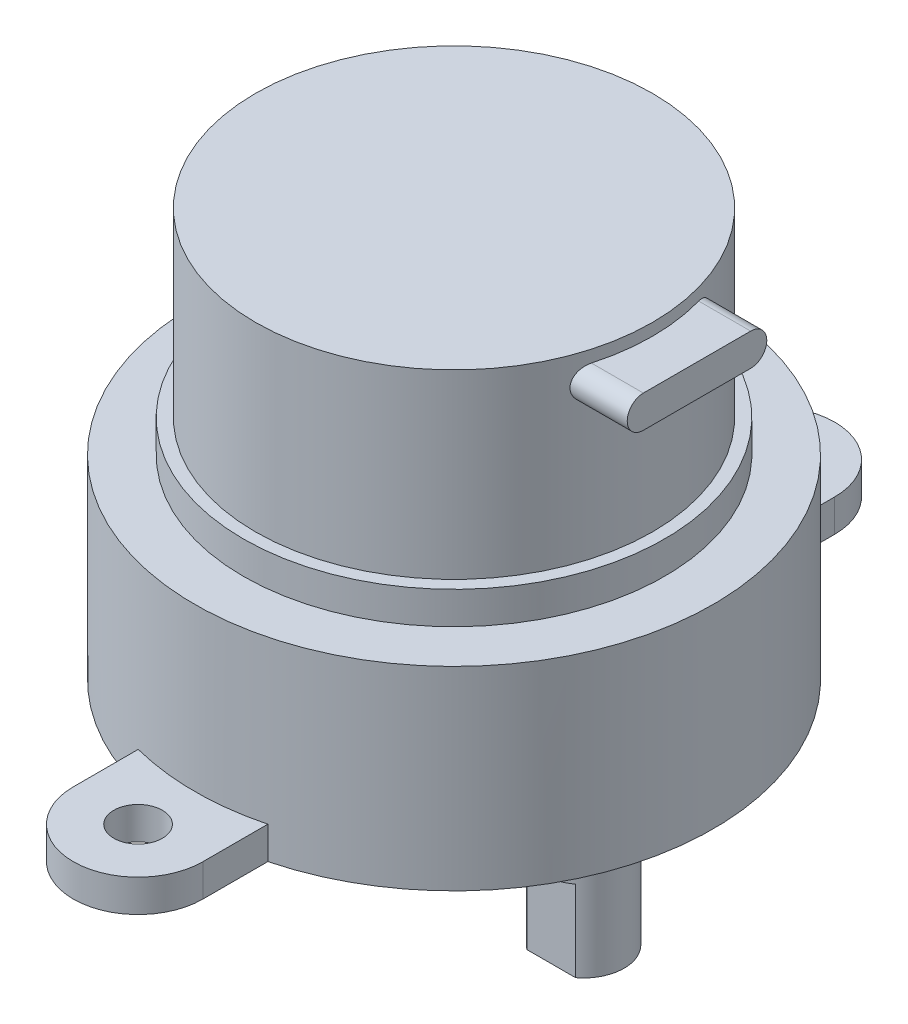
ISO-10303-21;
HEADER;
FILE_DESCRIPTION(('STEP AP214'),'2;1');
FILE_NAME('part.step','',(''),(''),'','','');
FILE_SCHEMA(('AUTOMOTIVE_DESIGN { 1 0 10303 214 1 1 1 1 }'));
ENDSEC;
DATA;
#1=APPLICATION_CONTEXT('core data for automotive mechanical design processes');
#2=APPLICATION_PROTOCOL_DEFINITION('international standard','automotive_design',2000,#1);
#3=PRODUCT_CONTEXT('',#1,'mechanical');
#4=PRODUCT('Part','Part','',(#3));
#5=PRODUCT_RELATED_PRODUCT_CATEGORY('part','',(#4));
#6=PRODUCT_DEFINITION_FORMATION('','',#4);
#7=PRODUCT_DEFINITION_CONTEXT('part definition',#1,'design');
#8=PRODUCT_DEFINITION('design','',#6,#7);
#9=PRODUCT_DEFINITION_SHAPE('','',#8);
#10=(LENGTH_UNIT() NAMED_UNIT(*) SI_UNIT(.MILLI.,.METRE.));
#11=(NAMED_UNIT(*) PLANE_ANGLE_UNIT() SI_UNIT($,.RADIAN.));
#12=(NAMED_UNIT(*) SI_UNIT($,.STERADIAN.) SOLID_ANGLE_UNIT());
#13=UNCERTAINTY_MEASURE_WITH_UNIT(LENGTH_MEASURE(1.E-05),#10,'distance_accuracy_value','');
#14=(GEOMETRIC_REPRESENTATION_CONTEXT(3) GLOBAL_UNCERTAINTY_ASSIGNED_CONTEXT((#13)) GLOBAL_UNIT_ASSIGNED_CONTEXT((#10,
#11,#12)) REPRESENTATION_CONTEXT('',''));
#15=CARTESIAN_POINT('',(0.,0.,0.));
#16=DIRECTION('',(0.,0.,1.));
#17=DIRECTION('',(1.,0.,0.));
#18=AXIS2_PLACEMENT_3D('',#15,#16,#17);
#19=CARTESIAN_POINT('',(0.,0.,0.));
#20=DIRECTION('',(0.,-1.,0.));
#21=DIRECTION('',(0.,0.,-1.));
#22=AXIS2_PLACEMENT_3D('',#19,#20,#21);
#23=CYLINDRICAL_SURFACE('',#22,12.25);
#24=CARTESIAN_POINT('',(0.,25.2,0.));
#25=DIRECTION('',(0.,-1.,0.));
#26=DIRECTION('',(0.,0.,-1.));
#27=AXIS2_PLACEMENT_3D('',#24,#25,#26);
#28=CIRCLE('',#27,12.25);
#29=CARTESIAN_POINT('',(0.,25.2,-12.25));
#30=VERTEX_POINT('',#29);
#31=EDGE_CURVE('E278',#30,#30,#28,.T.);
#32=ORIENTED_EDGE('',*,*,#31,.T.);
#33=EDGE_LOOP('',(#32));
#34=FACE_BOUND('',#33,.T.);
#35=CARTESIAN_POINT('',(0.,14.,0.));
#36=DIRECTION('',(0.,-1.,0.));
#37=DIRECTION('',(0.,0.,-1.));
#38=AXIS2_PLACEMENT_3D('',#35,#36,#37);
#39=CIRCLE('',#38,12.25);
#40=CARTESIAN_POINT('',(0.,14.,-12.25));
#41=VERTEX_POINT('',#40);
#42=EDGE_CURVE('E287',#41,#41,#39,.T.);
#43=ORIENTED_EDGE('',*,*,#42,.F.);
#44=EDGE_LOOP('',(#43));
#45=FACE_BOUND('',#44,.T.);
#46=CARTESIAN_POINT('',(11.4675809570313,23.4612473633165,4.30779375016186));
#47=CARTESIAN_POINT('',(11.4675823385033,23.4077593335019,4.30779099344668));
#48=CARTESIAN_POINT('',(11.4692095829825,23.3542324061449,4.30346594018228));
#49=CARTESIAN_POINT('',(11.4756264183926,23.2487126442959,4.28632456457978));
#50=CARTESIAN_POINT('',(11.4804197990567,23.1967217263525,4.27349806630176));
#51=CARTESIAN_POINT('',(11.4928785863639,23.0958726618714,4.23987736918563));
#52=CARTESIAN_POINT('',(11.5005382010916,23.0470084287369,4.21909923662842));
#53=CARTESIAN_POINT('',(11.518320468869,22.9535502882085,4.17030750836902));
#54=CARTESIAN_POINT('',(11.5284429165426,22.9089560251726,4.14229451597171));
#55=CARTESIAN_POINT('',(11.5510118962276,22.8237440599832,4.07894422169009));
#56=CARTESIAN_POINT('',(11.5635202930667,22.783290687833,4.04340828197144));
#57=CARTESIAN_POINT('',(11.5900882844105,22.7088463008351,3.96661105890876));
#58=CARTESIAN_POINT('',(11.6041483029992,22.6748570596894,3.925348209507));
#59=CARTESIAN_POINT('',(11.6341173315314,22.6122614029789,3.83564508294493));
#60=CARTESIAN_POINT('',(11.6500862627698,22.5840805837996,3.78692756659087));
#61=CARTESIAN_POINT('',(11.6825398072531,22.5363386466494,3.68559280317175));
#62=CARTESIAN_POINT('',(11.6990245400917,22.516779543808,3.63297464777481));
#63=CARTESIAN_POINT('',(11.7325675982206,22.4861915054121,3.52317613039095));
#64=CARTESIAN_POINT('',(11.7496244167997,22.4755074494151,3.46589883774411));
#65=CARTESIAN_POINT('',(11.7831408326881,22.4642703803288,3.35018212660029));
#66=CARTESIAN_POINT('',(11.7996004079001,22.4637177417107,3.29174266522786));
#67=CARTESIAN_POINT('',(11.8314587324005,22.4728883276969,3.17533116369798));
#68=CARTESIAN_POINT('',(11.84685675928,22.482618477868,3.11735946509733));
#69=CARTESIAN_POINT('',(11.8761869827589,22.5122529371446,3.00368583889532));
#70=CARTESIAN_POINT('',(11.8901193763927,22.5321558765436,2.9479836068135));
#71=CARTESIAN_POINT('',(11.9158790092058,22.5810592774422,2.84204598768388));
#72=CARTESIAN_POINT('',(11.9277517038988,22.6098087217877,2.79170585742785));
#73=CARTESIAN_POINT('',(11.949632335806,22.6758383814183,2.69651165120903));
#74=CARTESIAN_POINT('',(11.9596406051303,22.7131170747471,2.65165659867932));
#75=CARTESIAN_POINT('',(11.9773967935066,22.7938797488304,2.5702436297962));
#76=CARTESIAN_POINT('',(11.9852056846173,22.8371328356567,2.53346986273346));
#77=CARTESIAN_POINT('',(11.9989219203498,22.9294581614255,2.46769230545546));
#78=CARTESIAN_POINT('',(12.0048295134508,22.9785296388188,2.43868750000334));
#79=CARTESIAN_POINT('',(12.0146228931243,23.0798989965581,2.38996720561662));
#80=CARTESIAN_POINT('',(12.0185511643041,23.1320994878135,2.37005746040349));
#81=CARTESIAN_POINT('',(12.0245910267929,23.2391896067734,2.33922205814041));
#82=CARTESIAN_POINT('',(12.0267027499351,23.2940790390264,2.32829574913396));
#83=CARTESIAN_POINT('',(12.0291054400941,23.4043170657962,2.31585027769195));
#84=CARTESIAN_POINT('',(12.0294168824626,23.4596532990215,2.31422532904822));
#85=CARTESIAN_POINT('',(12.0282756116245,23.5698130004914,2.32014969518336));
#86=CARTESIAN_POINT('',(12.0268229526254,23.6246364844395,2.32769872806355));
#87=CARTESIAN_POINT('',(12.0221529317679,23.7320583190176,2.35169855398662));
#88=CARTESIAN_POINT('',(12.0189404963002,23.7846624418819,2.36812449492607));
#89=CARTESIAN_POINT('',(12.010744672023,23.8863316202914,2.4093466683474));
#90=CARTESIAN_POINT('',(12.0057612816738,23.9353966727596,2.43414290810688));
#91=CARTESIAN_POINT('',(11.9939963491293,24.0288544243439,2.49146706923415));
#92=CARTESIAN_POINT('',(11.9872066244494,24.0732245443576,2.52403010202333));
#93=CARTESIAN_POINT('',(11.9718658137999,24.1558442883359,2.59581832362416));
#94=CARTESIAN_POINT('',(11.9633146508401,24.1940936446399,2.63504380362966));
#95=CARTESIAN_POINT('',(11.9443922091913,24.2639704856366,2.71953861939047));
#96=CARTESIAN_POINT('',(11.9339979907413,24.2955019572501,2.76488216825394));
#97=CARTESIAN_POINT('',(11.9115991849343,24.3505329164594,2.85983963253004));
#98=CARTESIAN_POINT('',(11.8995944320143,24.3740315773993,2.90945398679372));
#99=CARTESIAN_POINT('',(11.87386396104,24.4129688241672,3.01276497878558));
#100=CARTESIAN_POINT('',(11.8601038428095,24.428200338636,3.06653103090423));
#101=CARTESIAN_POINT('',(11.8313833390476,24.4494706012072,3.17553874700752));
#102=CARTESIAN_POINT('',(11.8164227553828,24.4555078285208,3.2307806535698));
#103=CARTESIAN_POINT('',(11.7851788909282,24.4584089547756,3.34298560264983));
#104=CARTESIAN_POINT('',(11.7688689516277,24.4549819026307,3.39994877404448));
#105=CARTESIAN_POINT('',(11.7358160357641,24.4385179670514,3.51234343943391));
#106=CARTESIAN_POINT('',(11.7190729839281,24.425479402206,3.56777466367368));
#107=CARTESIAN_POINT('',(11.6852796808295,24.3897257005263,3.67696675730414));
#108=CARTESIAN_POINT('',(11.668231920419,24.36678189258,3.73065371093514));
#109=CARTESIAN_POINT('',(11.6348851678132,24.3117595834273,3.83338846061191));
#110=CARTESIAN_POINT('',(11.618586204954,24.2796807246852,3.88243607497911));
#111=CARTESIAN_POINT('',(11.5874930528142,24.2072754968389,3.97427350910224));
#112=CARTESIAN_POINT('',(11.5726937709582,24.1669785425613,4.01708473889054));
#113=CARTESIAN_POINT('',(11.5452641666523,24.0790458869729,4.09525282774274));
#114=CARTESIAN_POINT('',(11.5326338724324,24.03141009016,4.13060958978566));
#115=CARTESIAN_POINT('',(11.5107335226863,23.9322345374763,4.19124240582583));
#116=CARTESIAN_POINT('',(11.5013453292659,23.8809403371594,4.21687727777042));
#117=CARTESIAN_POINT('',(11.485800954343,23.7743336095482,4.25903599311431));
#118=CARTESIAN_POINT('',(11.4796391428014,23.719028275049,4.27557571011682));
#119=CARTESIAN_POINT('',(11.4727370937353,23.6295788049058,4.29404844374202));
#120=CARTESIAN_POINT('',(11.4708084072725,23.5961551420819,4.29919387044317));
#121=CARTESIAN_POINT('',(11.4682299239353,23.5289086207151,4.30606733686667));
#122=CARTESIAN_POINT('',(11.4675800830634,23.4950857759459,4.30779549415704));
#123=CARTESIAN_POINT('',(11.4675809570313,23.4612473633165,4.30779375016186));
#124=B_SPLINE_CURVE_WITH_KNOTS('',3,(#46,#47,#48,#49,#50,#51,#52,#53,#54,#55,#56,#57,#58,#59,
#60,#61,#62,#63,#64,#65,#66,#67,#68,#69,#70,#71,#72,#73,#74,#75,#76,#77,#78,#79,#80,#81,#82,#83,
#84,#85,#86,#87,#88,#89,#90,#91,#92,#93,#94,#95,#96,#97,#98,#99,#100,#101,#102,#103,#104,#105,
#106,#107,#108,#109,#110,#111,#112,#113,#114,#115,#116,#117,#118,#119,#120,#121,#122,#123),
.UNSPECIFIED.,.T.,.F.,(4,2,2,2,2,2,2,2,2,2,2,2,2,2,2,2,2,2,2,2,2,2,2,2,2,2,2,2,2,2,2,2,2,2,2,2,
2,2,4),(0.,0.160335631717507,0.320863527145081,0.481068773864909,0.641260665603355,
0.806375694334494,0.97153596404701,1.14625874597288,1.32102234373742,1.50229573412719,
1.6835758246187,1.8649780870221,2.04635593110691,2.22299956749898,2.39961170820781,
2.57069285143226,2.74175162709696,2.9089630727303,3.07616238222651,3.24145626369603,
3.40674506613324,3.57157349953342,3.736402076245,3.90199041035302,4.06758598365019,
4.2354094559419,4.40325019374128,4.57512083232464,4.74701989622891,4.92426180413779,
5.10153472560851,5.28313948744046,5.46475135805334,5.6457242523715,5.8266995019331,
6.0001297597559,6.17325636448256,6.27469382540995,6.37612779641367),.UNSPECIFIED.);
#125=CARTESIAN_POINT('',(11.7938401604838,24.4572690396545,3.31177207382386));
#126=VERTEX_POINT('',#125);
#127=CARTESIAN_POINT('',(11.7938401604838,22.4652256869785,3.31177207382386));
#128=VERTEX_POINT('',#127);
#129=EDGE_CURVE('E11',#126,#128,#124,.T.);
#130=ORIENTED_EDGE('',*,*,#129,.F.);
#131=CARTESIAN_POINT('',(0.,24.4572690396545,0.));
#132=DIRECTION('',(0.,-1.,0.));
#133=DIRECTION('',(0.,0.,-1.));
#134=AXIS2_PLACEMENT_3D('',#131,#132,#133);
#135=CIRCLE('',#134,12.25);
#136=CARTESIAN_POINT('',(11.7938401604838,24.4572690396545,-3.31177207382386));
#137=VERTEX_POINT('',#136);
#138=EDGE_CURVE('E318',#137,#126,#135,.T.);
#139=ORIENTED_EDGE('',*,*,#138,.F.);
#140=CARTESIAN_POINT('',(12.0291229978143,23.4612473633165,-2.31575039748586));
#141=CARTESIAN_POINT('',(12.0291228553257,23.4061389226955,-2.31575289313123));
#142=CARTESIAN_POINT('',(12.0282421603531,23.3509919431753,-2.32034049925517));
#143=CARTESIAN_POINT('',(12.0247123860103,23.2422276986138,-2.33856254909503));
#144=CARTESIAN_POINT('',(12.0220612662266,23.1886122731202,-2.35220743120757));
#145=CARTESIAN_POINT('',(12.014981252209,23.0845097052514,-2.38810763952254));
#146=CARTESIAN_POINT('',(12.0105536134619,23.0340203826486,-2.41035688451991));
#147=CARTESIAN_POINT('',(11.9999171649735,22.9375537194032,-2.46276254765663));
#148=CARTESIAN_POINT('',(11.9937087670059,22.8915753389679,-2.49291713766545));
#149=CARTESIAN_POINT('',(11.979486149344,22.8051149912536,-2.56039123389823));
#150=CARTESIAN_POINT('',(11.9714619965741,22.764665298295,-2.59774997765174));
#151=CARTESIAN_POINT('',(11.9536813163949,22.6906198009533,-2.67837714902325));
#152=CARTESIAN_POINT('',(11.9439246245273,22.6570246478765,-2.7216461375708));
#153=CARTESIAN_POINT('',(11.9226050196896,22.5969952275102,-2.81358314820831));
#154=CARTESIAN_POINT('',(11.9110142443529,22.5706922707957,-2.86233038597002));
#155=CARTESIAN_POINT('',(11.8863279108954,22.5265983734431,-2.96317442875599));
#156=CARTESIAN_POINT('',(11.8732321641352,22.508808501316,-3.01527165332002));
#157=CARTESIAN_POINT('',(11.8454086442429,22.4817007760372,-3.12281276152129));
#158=CARTESIAN_POINT('',(11.8306461091522,22.4726271358747,-3.17830916370482));
#159=CARTESIAN_POINT('',(11.8001379643754,22.4639000023519,-3.28976969102008));
#160=CARTESIAN_POINT('',(11.7843921853909,22.4642481357524,-3.3457338952548));
#161=CARTESIAN_POINT('',(11.7518369919498,22.4744029827549,-3.45837656968306));
#162=CARTESIAN_POINT('',(11.7350097444568,22.4845017309319,-3.51502364734338));
#163=CARTESIAN_POINT('',(11.7012793111345,22.5142644324736,-3.62572948547661));
#164=CARTESIAN_POINT('',(11.6843761135055,22.5339299269048,-3.6797878273995));
#165=CARTESIAN_POINT('',(11.6508013500551,22.5827551992244,-3.78476130023629));
#166=CARTESIAN_POINT('',(11.6341388613286,22.6120734602319,-3.83560580751444));
#167=CARTESIAN_POINT('',(11.6020427934053,22.6794033770414,-3.93162420764904));
#168=CARTESIAN_POINT('',(11.5866091966694,22.7174149087412,-3.97679818144184));
#169=CARTESIAN_POINT('',(11.5579491173835,22.8005041968163,-4.05933402552607));
#170=CARTESIAN_POINT('',(11.5446900688513,22.8454532897723,-4.09681380204468));
#171=CARTESIAN_POINT('',(11.5207842854396,22.9416991413625,-4.16356711000504));
#172=CARTESIAN_POINT('',(11.5101366360511,22.9929936683392,-4.19284351477101));
#173=CARTESIAN_POINT('',(11.4925767489849,23.0976137924924,-4.24073095976884));
#174=CARTESIAN_POINT('',(11.4854980848176,23.1506923260232,-4.25982026684391));
#175=CARTESIAN_POINT('',(11.4747090452421,23.2596274889466,-4.28879883558905));
#176=CARTESIAN_POINT('',(11.4709973032477,23.3154829814918,-4.29869182995334));
#177=CARTESIAN_POINT('',(11.4672904833259,23.4250471614881,-4.30856985059715));
#178=CARTESIAN_POINT('',(11.4671006457497,23.4787030484158,-4.30907407730417));
#179=CARTESIAN_POINT('',(11.4699513629619,23.5853099372084,-4.30148021162517));
#180=CARTESIAN_POINT('',(11.4729915093543,23.6382610273301,-4.29338320677032));
#181=CARTESIAN_POINT('',(11.482042441929,23.7410546409375,-4.26911738851811));
#182=CARTESIAN_POINT('',(11.4880023774942,23.7909344805128,-4.25308669983221));
#183=CARTESIAN_POINT('',(11.5025438942778,23.8872470778856,-4.2135999088054));
#184=CARTESIAN_POINT('',(11.5111257963249,23.9336794129752,-4.19014289775285));
#185=CARTESIAN_POINT('',(11.5308024301263,24.0234370516613,-4.13569305169541));
#186=CARTESIAN_POINT('',(11.541969482943,24.0666132122947,-4.10448094364599));
#187=CARTESIAN_POINT('',(11.5661279313887,24.1471742367255,-4.03590196440492));
#188=CARTESIAN_POINT('',(11.579119799787,24.1845575944398,-3.99853349780141));
#189=CARTESIAN_POINT('',(11.6071789919347,24.2547298441668,-3.91636092482331));
#190=CARTESIAN_POINT('',(11.6223225375842,24.2871334219824,-3.87125369283732));
#191=CARTESIAN_POINT('',(11.6534519627556,24.3439299365395,-3.77651208608961));
#192=CARTESIAN_POINT('',(11.6694380564882,24.3683208246088,-3.72687655767842));
#193=CARTESIAN_POINT('',(11.7024370069865,24.4094872927087,-3.62196428713271));
#194=CARTESIAN_POINT('',(11.7194631869705,24.4258591627592,-3.56653288403953));
#195=CARTESIAN_POINT('',(11.7532411802952,24.4488037553132,-3.45359173643233));
#196=CARTESIAN_POINT('',(11.7699929643278,24.4553754377231,-3.39608177198397));
#197=CARTESIAN_POINT('',(11.802902751075,24.4584727431792,-3.27988917122721));
#198=CARTESIAN_POINT('',(11.8190515792993,24.4548806103797,-3.2212006758717));
#199=CARTESIAN_POINT('',(11.8500971415596,24.4373478592483,-3.10504614431646));
#200=CARTESIAN_POINT('',(11.8649939933023,24.423408214971,-3.04757999357603));
#201=CARTESIAN_POINT('',(11.8928924844919,24.3858059570778,-2.93680229195475));
#202=CARTESIAN_POINT('',(11.9059264171865,24.3623461395958,-2.88343014143513));
#203=CARTESIAN_POINT('',(11.9301996840858,24.3062584666141,-2.78129337219548));
#204=CARTESIAN_POINT('',(11.9414394057494,24.2736325947308,-2.73252775962696));
#205=CARTESIAN_POINT('',(11.9616347229007,24.2012604972276,-2.64269773086271));
#206=CARTESIAN_POINT('',(11.9706517723668,24.1617747757959,-2.60143718884967));
#207=CARTESIAN_POINT('',(11.9867748134512,24.0760987628605,-2.52610719291297));
#208=CARTESIAN_POINT('',(11.993880621718,24.0299078287584,-2.4920384289869));
#209=CARTESIAN_POINT('',(12.005992981891,23.9334226533427,-2.4330064881146));
#210=CARTESIAN_POINT('',(12.0110481639672,23.8832620414687,-2.40783446116526));
#211=CARTESIAN_POINT('',(12.019309108042,23.779336591955,-2.36625491774498));
#212=CARTESIAN_POINT('',(12.0225172220688,23.7255764357884,-2.34983625685307));
#213=CARTESIAN_POINT('',(12.0262484315747,23.6364280820677,-2.33064399334522));
#214=CARTESIAN_POINT('',(12.027326342603,23.6016407431264,-2.32506679527641));
#215=CARTESIAN_POINT('',(12.028763668412,23.5316566332881,-2.31761921464727));
#216=CARTESIAN_POINT('',(12.0291230888598,23.4964598656228,-2.31574880284959));
#217=CARTESIAN_POINT('',(12.0291229978143,23.4612473633165,-2.31575039748586));
#218=B_SPLINE_CURVE_WITH_KNOTS('',3,(#140,#141,#142,#143,#144,#145,#146,#147,#148,#149,#150,
#151,#152,#153,#154,#155,#156,#157,#158,#159,#160,#161,#162,#163,#164,#165,#166,#167,#168,#169,
#170,#171,#172,#173,#174,#175,#176,#177,#178,#179,#180,#181,#182,#183,#184,#185,#186,#187,#188,
#189,#190,#191,#192,#193,#194,#195,#196,#197,#198,#199,#200,#201,#202,#203,#204,#205,#206,#207,
#208,#209,#210,#211,#212,#213,#214,#215,#216,#217),.UNSPECIFIED.,.T.,.F.,(4,2,2,2,2,2,2,2,2,2,2,
2,2,2,2,2,2,2,2,2,2,2,2,2,2,2,2,2,2,2,2,2,2,2,2,2,2,2,4),(0.,0.16519613219826,0.330582982185192,
0.49585315663109,0.661085145603034,0.827243877341872,0.993418389846258,1.16241519743595,
1.33143321092765,1.50505947822985,1.67871572398328,1.85773972987867,2.0367925835432,
2.21894544273645,2.40109570174005,2.58020281834711,2.7592471220067,2.92891450638551,
3.09851299430883,3.25870298018482,3.41887271420894,3.57634712356885,3.73384080951896,
3.89643039575452,4.0590621833284,4.23100014590652,4.40298203516394,4.58290638324749,
4.76284982533794,4.94488656206978,5.12690616509212,5.30523651165676,5.483528295621,
5.65612938477877,5.82874702620753,5.99699075851276,6.1650197752654,6.27057556676477,
6.37613052568712),.UNSPECIFIED.);
#219=CARTESIAN_POINT('',(11.7938401604839,22.4652256869772,-3.31177207382403));
#220=VERTEX_POINT('',#219);
#221=EDGE_CURVE('E67',#220,#137,#218,.T.);
#222=ORIENTED_EDGE('',*,*,#221,.F.);
#223=CARTESIAN_POINT('',(0.,22.4652256869785,0.));
#224=DIRECTION('',(0.,1.,0.));
#225=DIRECTION('',(0.,0.,1.));
#226=AXIS2_PLACEMENT_3D('',#223,#224,#225);
#227=CIRCLE('',#226,12.25);
#228=EDGE_CURVE('E57',#128,#220,#227,.T.);
#229=ORIENTED_EDGE('',*,*,#228,.F.);
#230=EDGE_LOOP('',(#130,#139,#222,#229));
#231=FACE_BOUND('',#230,.T.);
#232=ADVANCED_FACE('F44',(#34,#45,#231),#23,.T.);
#233=CARTESIAN_POINT('',(0.,0.,0.));
#234=DIRECTION('',(0.,1.,0.));
#235=DIRECTION('',(0.,0.,1.));
#236=AXIS2_PLACEMENT_3D('',#233,#234,#235);
#237=PLANE('',#236);
#238=CARTESIAN_POINT('',(8.,0.,0.));
#239=DIRECTION('',(0.,1.,0.));
#240=DIRECTION('',(-1.,0.,0.));
#241=AXIS2_PLACEMENT_3D('',#238,#239,#240);
#242=CIRCLE('',#241,4.5);
#243=CARTESIAN_POINT('',(3.5,0.,0.));
#244=VERTEX_POINT('',#243);
#245=EDGE_CURVE('E201',#244,#244,#242,.T.);
#246=ORIENTED_EDGE('',*,*,#245,.T.);
#247=EDGE_LOOP('',(#246));
#248=FACE_BOUND('',#247,.T.);
#249=CARTESIAN_POINT('',(0.,0.,0.));
#250=DIRECTION('',(0.,-1.,0.));
#251=DIRECTION('',(0.,0.,-1.));
#252=AXIS2_PLACEMENT_3D('',#249,#250,#251);
#253=CIRCLE('',#252,16.);
#254=CARTESIAN_POINT('',(4.,0.,-15.4919333848297));
#255=VERTEX_POINT('',#254);
#256=CARTESIAN_POINT('',(3.99999999999999,0.,15.4919333848297));
#257=VERTEX_POINT('',#256);
#258=EDGE_CURVE('E300',#255,#257,#253,.T.);
#259=ORIENTED_EDGE('',*,*,#258,.T.);
#260=DIRECTION('',(0.,0.,1.));
#261=VECTOR('',#260,1.);
#262=CARTESIAN_POINT('',(4.,0.,-19.5));
#263=LINE('',#262,#261);
#264=CARTESIAN_POINT('',(3.99999999999999,0.,19.5));
#265=VERTEX_POINT('',#264);
#266=EDGE_CURVE('E267',#257,#265,#263,.T.);
#267=ORIENTED_EDGE('',*,*,#266,.T.);
#268=CARTESIAN_POINT('',(0.,0.,19.5));
#269=DIRECTION('',(0.,-1.,0.));
#270=DIRECTION('',(0.,0.,-1.));
#271=AXIS2_PLACEMENT_3D('',#268,#269,#270);
#272=CIRCLE('',#271,4.);
#273=CARTESIAN_POINT('',(-4.00000000000001,0.,19.5));
#274=VERTEX_POINT('',#273);
#275=EDGE_CURVE('E270',#265,#274,#272,.T.);
#276=ORIENTED_EDGE('',*,*,#275,.T.);
#277=DIRECTION('',(0.,0.,-1.));
#278=VECTOR('',#277,1.);
#279=CARTESIAN_POINT('',(-4.,0.,-19.5));
#280=LINE('',#279,#278);
#281=CARTESIAN_POINT('',(-4.,0.,15.4919333848297));
#282=VERTEX_POINT('',#281);
#283=EDGE_CURVE('E253',#274,#282,#280,.T.);
#284=ORIENTED_EDGE('',*,*,#283,.T.);
#285=CARTESIAN_POINT('',(-4.,0.,-15.4919333848297));
#286=VERTEX_POINT('',#285);
#287=EDGE_CURVE('E299',#282,#286,#253,.T.);
#288=ORIENTED_EDGE('',*,*,#287,.T.);
#289=CARTESIAN_POINT('',(-4.,0.,-19.5));
#290=VERTEX_POINT('',#289);
#291=EDGE_CURVE('E273',#286,#290,#280,.T.);
#292=ORIENTED_EDGE('',*,*,#291,.T.);
#293=CARTESIAN_POINT('',(0.,0.,-19.5));
#294=DIRECTION('',(0.,-1.,0.));
#295=DIRECTION('',(0.,0.,-1.));
#296=AXIS2_PLACEMENT_3D('',#293,#294,#295);
#297=CIRCLE('',#296,4.);
#298=CARTESIAN_POINT('',(4.,0.,-19.5));
#299=VERTEX_POINT('',#298);
#300=EDGE_CURVE('E246',#290,#299,#297,.T.);
#301=ORIENTED_EDGE('',*,*,#300,.T.);
#302=EDGE_CURVE('E268',#299,#255,#263,.T.);
#303=ORIENTED_EDGE('',*,*,#302,.T.);
#304=EDGE_LOOP('',(#259,#267,#276,#284,#288,#292,#301,#303));
#305=FACE_BOUND('',#304,.T.);
#306=CARTESIAN_POINT('',(0.,0.,-19.5));
#307=DIRECTION('',(0.,-1.,0.));
#308=DIRECTION('',(0.,0.,-1.));
#309=AXIS2_PLACEMENT_3D('',#306,#307,#308);
#310=CIRCLE('',#309,1.5);
#311=CARTESIAN_POINT('',(0.,0.,-21.));
#312=VERTEX_POINT('',#311);
#313=EDGE_CURVE('E236',#312,#312,#310,.T.);
#314=ORIENTED_EDGE('',*,*,#313,.F.);
#315=EDGE_LOOP('',(#314));
#316=FACE_BOUND('',#315,.T.);
#317=CARTESIAN_POINT('',(0.,0.,19.5));
#318=DIRECTION('',(0.,-1.,0.));
#319=DIRECTION('',(0.,0.,-1.));
#320=AXIS2_PLACEMENT_3D('',#317,#318,#319);
#321=CIRCLE('',#320,1.5);
#322=CARTESIAN_POINT('',(0.,0.,18.));
#323=VERTEX_POINT('',#322);
#324=EDGE_CURVE('E240',#323,#323,#321,.T.);
#325=ORIENTED_EDGE('',*,*,#324,.F.);
#326=EDGE_LOOP('',(#325));
#327=FACE_BOUND('',#326,.T.);
#328=ADVANCED_FACE('F46',(#248,#305,#316,#327),#237,.F.);
#329=CARTESIAN_POINT('',(0.,0.,0.));
#330=DIRECTION('',(0.,-1.,0.));
#331=DIRECTION('',(0.,0.,-1.));
#332=AXIS2_PLACEMENT_3D('',#329,#330,#331);
#333=CYLINDRICAL_SURFACE('',#332,16.);
#334=ORIENTED_EDGE('',*,*,#287,.F.);
#335=DIRECTION('',(0.,-1.,0.));
#336=VECTOR('',#335,1.);
#337=CARTESIAN_POINT('',(-4.,0.,15.4919333848297));
#338=LINE('',#337,#336);
#339=CARTESIAN_POINT('',(-4.,2.,15.4919333848297));
#340=VERTEX_POINT('',#339);
#341=EDGE_CURVE('E315',#282,#340,#338,.F.);
#342=ORIENTED_EDGE('',*,*,#341,.T.);
#343=CARTESIAN_POINT('',(0.,2.,0.));
#344=DIRECTION('',(0.,-1.,0.));
#345=DIRECTION('',(0.,0.,-1.));
#346=AXIS2_PLACEMENT_3D('',#343,#344,#345);
#347=CIRCLE('',#346,16.);
#348=CARTESIAN_POINT('',(3.99999999999999,2.,15.4919333848297));
#349=VERTEX_POINT('',#348);
#350=EDGE_CURVE('E306',#349,#340,#347,.T.);
#351=ORIENTED_EDGE('',*,*,#350,.F.);
#352=DIRECTION('',(0.,-1.,0.));
#353=VECTOR('',#352,1.);
#354=CARTESIAN_POINT('',(3.99999999999999,0.,15.4919333848297));
#355=LINE('',#354,#353);
#356=EDGE_CURVE('E312',#349,#257,#355,.T.);
#357=ORIENTED_EDGE('',*,*,#356,.T.);
#358=ORIENTED_EDGE('',*,*,#258,.F.);
#359=DIRECTION('',(0.,-1.,0.));
#360=VECTOR('',#359,1.);
#361=CARTESIAN_POINT('',(4.,0.,-15.4919333848297));
#362=LINE('',#361,#360);
#363=CARTESIAN_POINT('',(4.,2.,-15.4919333848297));
#364=VERTEX_POINT('',#363);
#365=EDGE_CURVE('E305',#255,#364,#362,.F.);
#366=ORIENTED_EDGE('',*,*,#365,.T.);
#367=CARTESIAN_POINT('',(-4.,2.,-15.4919333848297));
#368=VERTEX_POINT('',#367);
#369=EDGE_CURVE('E303',#368,#364,#347,.T.);
#370=ORIENTED_EDGE('',*,*,#369,.F.);
#371=DIRECTION('',(0.,-1.,0.));
#372=VECTOR('',#371,1.);
#373=CARTESIAN_POINT('',(-4.,0.,-15.4919333848297));
#374=LINE('',#373,#372);
#375=EDGE_CURVE('E309',#368,#286,#374,.T.);
#376=ORIENTED_EDGE('',*,*,#375,.T.);
#377=EDGE_LOOP('',(#334,#342,#351,#357,#358,#366,#370,#376));
#378=FACE_BOUND('',#377,.T.);
#379=CARTESIAN_POINT('',(0.,12.,0.));
#380=DIRECTION('',(0.,-1.,0.));
#381=DIRECTION('',(0.,0.,-1.));
#382=AXIS2_PLACEMENT_3D('',#379,#380,#381);
#383=CIRCLE('',#382,16.);
#384=CARTESIAN_POINT('',(0.,12.,-16.));
#385=VERTEX_POINT('',#384);
#386=EDGE_CURVE('E296',#385,#385,#383,.T.);
#387=ORIENTED_EDGE('',*,*,#386,.T.);
#388=EDGE_LOOP('',(#387));
#389=FACE_BOUND('',#388,.T.);
#390=ADVANCED_FACE('F433',(#378,#389),#333,.T.);
#391=CARTESIAN_POINT('',(-16.,12.,0.));
#392=DIRECTION('',(0.,-1.,0.));
#393=DIRECTION('',(0.,0.,-1.));
#394=AXIS2_PLACEMENT_3D('',#391,#392,#393);
#395=PLANE('',#394);
#396=ORIENTED_EDGE('',*,*,#386,.F.);
#397=EDGE_LOOP('',(#396));
#398=FACE_BOUND('',#397,.T.);
#399=CARTESIAN_POINT('',(0.,12.,0.));
#400=DIRECTION('',(0.,-1.,0.));
#401=DIRECTION('',(0.,0.,-1.));
#402=AXIS2_PLACEMENT_3D('',#399,#400,#401);
#403=CIRCLE('',#402,13.);
#404=CARTESIAN_POINT('',(0.,12.,-13.));
#405=VERTEX_POINT('',#404);
#406=EDGE_CURVE('E293',#405,#405,#403,.T.);
#407=ORIENTED_EDGE('',*,*,#406,.T.);
#408=EDGE_LOOP('',(#407));
#409=FACE_BOUND('',#408,.T.);
#410=ADVANCED_FACE('F629',(#398,#409),#395,.F.);
#411=CARTESIAN_POINT('',(0.,0.,0.));
#412=DIRECTION('',(0.,-1.,0.));
#413=DIRECTION('',(0.,0.,-1.));
#414=AXIS2_PLACEMENT_3D('',#411,#412,#413);
#415=CYLINDRICAL_SURFACE('',#414,13.);
#416=ORIENTED_EDGE('',*,*,#406,.F.);
#417=EDGE_LOOP('',(#416));
#418=FACE_BOUND('',#417,.T.);
#419=CARTESIAN_POINT('',(0.,14.,0.));
#420=DIRECTION('',(0.,-1.,0.));
#421=DIRECTION('',(0.,0.,-1.));
#422=AXIS2_PLACEMENT_3D('',#419,#420,#421);
#423=CIRCLE('',#422,13.);
#424=CARTESIAN_POINT('',(0.,14.,-13.));
#425=VERTEX_POINT('',#424);
#426=EDGE_CURVE('E290',#425,#425,#423,.T.);
#427=ORIENTED_EDGE('',*,*,#426,.T.);
#428=EDGE_LOOP('',(#427));
#429=FACE_BOUND('',#428,.T.);
#430=ADVANCED_FACE('F425',(#418,#429),#415,.T.);
#431=CARTESIAN_POINT('',(-13.,14.,0.));
#432=DIRECTION('',(0.,-1.,0.));
#433=DIRECTION('',(0.,0.,-1.));
#434=AXIS2_PLACEMENT_3D('',#431,#432,#433);
#435=PLANE('',#434);
#436=ORIENTED_EDGE('',*,*,#426,.F.);
#437=EDGE_LOOP('',(#436));
#438=FACE_BOUND('',#437,.T.);
#439=ORIENTED_EDGE('',*,*,#42,.T.);
#440=EDGE_LOOP('',(#439));
#441=FACE_BOUND('',#440,.T.);
#442=ADVANCED_FACE('F420',(#438,#441),#435,.F.);
#443=CARTESIAN_POINT('',(-12.25,25.2,0.));
#444=DIRECTION('',(0.,-1.,0.));
#445=DIRECTION('',(0.,0.,-1.));
#446=AXIS2_PLACEMENT_3D('',#443,#444,#445);
#447=PLANE('',#446);
#448=ORIENTED_EDGE('',*,*,#31,.F.);
#449=EDGE_LOOP('',(#448));
#450=FACE_BOUND('',#449,.T.);
#451=ADVANCED_FACE('F393',(#450),#447,.F.);
#452=CARTESIAN_POINT('',(0.,2.,-19.5));
#453=DIRECTION('',(0.,-1.,0.));
#454=DIRECTION('',(0.,0.,-1.));
#455=AXIS2_PLACEMENT_3D('',#452,#453,#454);
#456=CYLINDRICAL_SURFACE('',#455,1.5);
#457=CARTESIAN_POINT('',(0.,2.,-19.5));
#458=DIRECTION('',(0.,-1.,0.));
#459=DIRECTION('',(0.,0.,-1.));
#460=AXIS2_PLACEMENT_3D('',#457,#458,#459);
#461=CIRCLE('',#460,1.5);
#462=CARTESIAN_POINT('',(0.,2.,-21.));
#463=VERTEX_POINT('',#462);
#464=EDGE_CURVE('E237',#463,#463,#461,.T.);
#465=ORIENTED_EDGE('',*,*,#464,.F.);
#466=EDGE_LOOP('',(#465));
#467=FACE_BOUND('',#466,.T.);
#468=ORIENTED_EDGE('',*,*,#313,.T.);
#469=EDGE_LOOP('',(#468));
#470=FACE_BOUND('',#469,.T.);
#471=ADVANCED_FACE('F389',(#467,#470),#456,.F.);
#472=CARTESIAN_POINT('',(0.,2.,-19.5));
#473=DIRECTION('',(0.,-1.,0.));
#474=DIRECTION('',(0.,0.,-1.));
#475=AXIS2_PLACEMENT_3D('',#472,#473,#474);
#476=CYLINDRICAL_SURFACE('',#475,4.);
#477=ORIENTED_EDGE('',*,*,#300,.F.);
#478=DIRECTION('',(0.,-1.,0.));
#479=VECTOR('',#478,1.);
#480=CARTESIAN_POINT('',(-4.,2.,-19.5));
#481=LINE('',#480,#479);
#482=CARTESIAN_POINT('',(-4.,2.,-19.5));
#483=VERTEX_POINT('',#482);
#484=EDGE_CURVE('E275',#483,#290,#481,.T.);
#485=ORIENTED_EDGE('',*,*,#484,.F.);
#486=CARTESIAN_POINT('',(0.,2.,-19.5));
#487=DIRECTION('',(0.,-1.,0.));
#488=DIRECTION('',(0.,0.,-1.));
#489=AXIS2_PLACEMENT_3D('',#486,#487,#488);
#490=CIRCLE('',#489,4.);
#491=CARTESIAN_POINT('',(4.,2.,-19.5));
#492=VERTEX_POINT('',#491);
#493=EDGE_CURVE('E249',#483,#492,#490,.T.);
#494=ORIENTED_EDGE('',*,*,#493,.T.);
#495=DIRECTION('',(0.,-1.,0.));
#496=VECTOR('',#495,1.);
#497=CARTESIAN_POINT('',(4.,2.,-19.5));
#498=LINE('',#497,#496);
#499=EDGE_CURVE('E264',#492,#299,#498,.T.);
#500=ORIENTED_EDGE('',*,*,#499,.T.);
#501=EDGE_LOOP('',(#477,#485,#494,#500));
#502=FACE_BOUND('',#501,.T.);
#503=ADVANCED_FACE('F392',(#502),#476,.T.);
#504=CARTESIAN_POINT('',(0.,2.,-19.5));
#505=DIRECTION('',(0.,-1.,0.));
#506=DIRECTION('',(0.,0.,-1.));
#507=AXIS2_PLACEMENT_3D('',#504,#505,#506);
#508=PLANE('',#507);
#509=ORIENTED_EDGE('',*,*,#464,.T.);
#510=EDGE_LOOP('',(#509));
#511=FACE_BOUND('',#510,.T.);
#512=DIRECTION('',(0.,0.,-1.));
#513=VECTOR('',#512,1.);
#514=CARTESIAN_POINT('',(-4.,2.,-19.5));
#515=LINE('',#514,#513);
#516=EDGE_CURVE('E260',#368,#483,#515,.T.);
#517=ORIENTED_EDGE('',*,*,#516,.F.);
#518=ORIENTED_EDGE('',*,*,#369,.T.);
#519=DIRECTION('',(0.,0.,1.));
#520=VECTOR('',#519,1.);
#521=CARTESIAN_POINT('',(4.,2.,-19.5));
#522=LINE('',#521,#520);
#523=EDGE_CURVE('E254',#492,#364,#522,.T.);
#524=ORIENTED_EDGE('',*,*,#523,.F.);
#525=ORIENTED_EDGE('',*,*,#493,.F.);
#526=EDGE_LOOP('',(#517,#518,#524,#525));
#527=FACE_BOUND('',#526,.T.);
#528=ADVANCED_FACE('F399',(#511,#527),#508,.F.);
#529=CARTESIAN_POINT('',(4.,2.,-19.5));
#530=DIRECTION('',(1.,0.,0.));
#531=DIRECTION('',(0.,0.,-1.));
#532=AXIS2_PLACEMENT_3D('',#529,#530,#531);
#533=PLANE('',#532);
#534=ORIENTED_EDGE('',*,*,#365,.F.);
#535=ORIENTED_EDGE('',*,*,#302,.F.);
#536=ORIENTED_EDGE('',*,*,#499,.F.);
#537=ORIENTED_EDGE('',*,*,#523,.T.);
#538=EDGE_LOOP('',(#534,#535,#536,#537));
#539=FACE_BOUND('',#538,.T.);
#540=ADVANCED_FACE('F402',(#539),#533,.T.);
#541=CARTESIAN_POINT('',(-4.,2.,-19.5));
#542=DIRECTION('',(-1.,0.,0.));
#543=DIRECTION('',(0.,0.,1.));
#544=AXIS2_PLACEMENT_3D('',#541,#542,#543);
#545=PLANE('',#544);
#546=ORIENTED_EDGE('',*,*,#375,.F.);
#547=ORIENTED_EDGE('',*,*,#516,.T.);
#548=ORIENTED_EDGE('',*,*,#484,.T.);
#549=ORIENTED_EDGE('',*,*,#291,.F.);
#550=EDGE_LOOP('',(#546,#547,#548,#549));
#551=FACE_BOUND('',#550,.T.);
#552=ADVANCED_FACE('F405',(#551),#545,.T.);
#553=ORIENTED_EDGE('',*,*,#341,.F.);
#554=ORIENTED_EDGE('',*,*,#283,.F.);
#555=DIRECTION('',(0.,-1.,0.));
#556=VECTOR('',#555,1.);
#557=CARTESIAN_POINT('',(-4.00000000000001,2.,19.5));
#558=LINE('',#557,#556);
#559=CARTESIAN_POINT('',(-4.00000000000001,2.,19.5));
#560=VERTEX_POINT('',#559);
#561=EDGE_CURVE('E279',#560,#274,#558,.T.);
#562=ORIENTED_EDGE('',*,*,#561,.F.);
#563=EDGE_CURVE('E261',#560,#340,#515,.T.);
#564=ORIENTED_EDGE('',*,*,#563,.T.);
#565=EDGE_LOOP('',(#553,#554,#562,#564));
#566=FACE_BOUND('',#565,.T.);
#567=ADVANCED_FACE('F408',(#566),#545,.T.);
#568=ORIENTED_EDGE('',*,*,#356,.F.);
#569=CARTESIAN_POINT('',(3.99999999999999,2.,19.5));
#570=VERTEX_POINT('',#569);
#571=EDGE_CURVE('E252',#349,#570,#522,.T.);
#572=ORIENTED_EDGE('',*,*,#571,.T.);
#573=DIRECTION('',(0.,-1.,0.));
#574=VECTOR('',#573,1.);
#575=CARTESIAN_POINT('',(3.99999999999999,2.,19.5));
#576=LINE('',#575,#574);
#577=EDGE_CURVE('E281',#570,#265,#576,.T.);
#578=ORIENTED_EDGE('',*,*,#577,.T.);
#579=ORIENTED_EDGE('',*,*,#266,.F.);
#580=EDGE_LOOP('',(#568,#572,#578,#579));
#581=FACE_BOUND('',#580,.T.);
#582=ADVANCED_FACE('F413',(#581),#533,.T.);
#583=CARTESIAN_POINT('',(0.,2.,19.5));
#584=DIRECTION('',(0.,-1.,0.));
#585=DIRECTION('',(0.,0.,-1.));
#586=AXIS2_PLACEMENT_3D('',#583,#584,#585);
#587=CIRCLE('',#586,1.5);
#588=CARTESIAN_POINT('',(0.,2.,18.));
#589=VERTEX_POINT('',#588);
#590=EDGE_CURVE('E243',#589,#589,#587,.T.);
#591=ORIENTED_EDGE('',*,*,#590,.T.);
#592=EDGE_LOOP('',(#591));
#593=FACE_BOUND('',#592,.T.);
#594=ORIENTED_EDGE('',*,*,#571,.F.);
#595=ORIENTED_EDGE('',*,*,#350,.T.);
#596=ORIENTED_EDGE('',*,*,#563,.F.);
#597=CARTESIAN_POINT('',(0.,2.,19.5));
#598=DIRECTION('',(0.,-1.,0.));
#599=DIRECTION('',(0.,0.,-1.));
#600=AXIS2_PLACEMENT_3D('',#597,#598,#599);
#601=CIRCLE('',#600,4.);
#602=EDGE_CURVE('E257',#570,#560,#601,.T.);
#603=ORIENTED_EDGE('',*,*,#602,.F.);
#604=EDGE_LOOP('',(#594,#595,#596,#603));
#605=FACE_BOUND('',#604,.T.);
#606=ADVANCED_FACE('F404',(#593,#605),#508,.F.);
#607=CARTESIAN_POINT('',(0.,2.,19.5));
#608=DIRECTION('',(0.,-1.,0.));
#609=DIRECTION('',(0.,0.,-1.));
#610=AXIS2_PLACEMENT_3D('',#607,#608,#609);
#611=CYLINDRICAL_SURFACE('',#610,4.);
#612=ORIENTED_EDGE('',*,*,#275,.F.);
#613=ORIENTED_EDGE('',*,*,#577,.F.);
#614=ORIENTED_EDGE('',*,*,#602,.T.);
#615=ORIENTED_EDGE('',*,*,#561,.T.);
#616=EDGE_LOOP('',(#612,#613,#614,#615));
#617=FACE_BOUND('',#616,.T.);
#618=ADVANCED_FACE('F397',(#617),#611,.T.);
#619=CARTESIAN_POINT('',(0.,2.,19.5));
#620=DIRECTION('',(0.,-1.,0.));
#621=DIRECTION('',(0.,0.,-1.));
#622=AXIS2_PLACEMENT_3D('',#619,#620,#621);
#623=CYLINDRICAL_SURFACE('',#622,1.5);
#624=ORIENTED_EDGE('',*,*,#590,.F.);
#625=EDGE_LOOP('',(#624));
#626=FACE_BOUND('',#625,.T.);
#627=ORIENTED_EDGE('',*,*,#324,.T.);
#628=EDGE_LOOP('',(#627));
#629=FACE_BOUND('',#628,.T.);
#630=ADVANCED_FACE('F387',(#626,#629),#623,.F.);
#631=CARTESIAN_POINT('',(8.,-10.2,0.));
#632=DIRECTION('',(0.,-1.,0.));
#633=DIRECTION('',(1.,0.,0.));
#634=AXIS2_PLACEMENT_3D('',#631,#632,#633);
#635=PLANE('',#634);
#636=DIRECTION('',(1.,0.,0.));
#637=VECTOR('',#636,1.);
#638=CARTESIAN_POINT('',(5.32727360302391,-10.2,2.));
#639=LINE('',#638,#637);
#640=CARTESIAN_POINT('',(6.5,-10.2,2.));
#641=VERTEX_POINT('',#640);
#642=CARTESIAN_POINT('',(9.5,-10.2,2.));
#643=VERTEX_POINT('',#642);
#644=EDGE_CURVE('E193',#641,#643,#639,.T.);
#645=ORIENTED_EDGE('',*,*,#644,.F.);
#646=CARTESIAN_POINT('',(8.,-10.2,0.));
#647=DIRECTION('',(0.,1.,0.));
#648=DIRECTION('',(-1.,0.,0.));
#649=AXIS2_PLACEMENT_3D('',#646,#647,#648);
#650=CIRCLE('',#649,2.5);
#651=CARTESIAN_POINT('',(6.5,-10.2,-2.));
#652=VERTEX_POINT('',#651);
#653=EDGE_CURVE('E216',#652,#641,#650,.T.);
#654=ORIENTED_EDGE('',*,*,#653,.F.);
#655=DIRECTION('',(-1.,0.,0.));
#656=VECTOR('',#655,1.);
#657=CARTESIAN_POINT('',(3.62547666157584,-10.2,-2.));
#658=LINE('',#657,#656);
#659=CARTESIAN_POINT('',(9.5,-10.2,-2.));
#660=VERTEX_POINT('',#659);
#661=EDGE_CURVE('E182',#660,#652,#658,.T.);
#662=ORIENTED_EDGE('',*,*,#661,.F.);
#663=EDGE_CURVE('E219',#643,#660,#650,.T.);
#664=ORIENTED_EDGE('',*,*,#663,.F.);
#665=EDGE_LOOP('',(#645,#654,#662,#664));
#666=FACE_BOUND('',#665,.T.);
#667=CARTESIAN_POINT('',(8.,-10.2,0.));
#668=DIRECTION('',(0.,-1.,0.));
#669=DIRECTION('',(0.,0.,-1.));
#670=AXIS2_PLACEMENT_3D('',#667,#668,#669);
#671=CIRCLE('',#670,1.24999999999999);
#672=CARTESIAN_POINT('',(8.,-10.2,-1.24999999999999));
#673=VERTEX_POINT('',#672);
#674=EDGE_CURVE('E192',#673,#673,#671,.T.);
#675=ORIENTED_EDGE('',*,*,#674,.F.);
#676=EDGE_LOOP('',(#675));
#677=FACE_BOUND('',#676,.T.);
#678=ADVANCED_FACE('F383',(#666,#677),#635,.T.);
#679=CARTESIAN_POINT('',(8.,0.,0.));
#680=DIRECTION('',(0.,1.,0.));
#681=DIRECTION('',(-1.,0.,0.));
#682=AXIS2_PLACEMENT_3D('',#679,#680,#681);
#683=CYLINDRICAL_SURFACE('',#682,2.5);
#684=DIRECTION('',(0.,1.,0.));
#685=VECTOR('',#684,1.);
#686=CARTESIAN_POINT('',(6.5,0.,2.));
#687=LINE('',#686,#685);
#688=CARTESIAN_POINT('',(6.5,-5.2,2.));
#689=VERTEX_POINT('',#688);
#690=EDGE_CURVE('E234',#689,#641,#687,.F.);
#691=ORIENTED_EDGE('',*,*,#690,.F.);
#692=CARTESIAN_POINT('',(8.,-5.2,0.));
#693=DIRECTION('',(0.,-1.,0.));
#694=DIRECTION('',(1.,0.,0.));
#695=AXIS2_PLACEMENT_3D('',#692,#693,#694);
#696=CIRCLE('',#695,2.5);
#697=CARTESIAN_POINT('',(9.5,-5.2,2.));
#698=VERTEX_POINT('',#697);
#699=EDGE_CURVE('E228',#689,#698,#696,.F.);
#700=ORIENTED_EDGE('',*,*,#699,.T.);
#701=DIRECTION('',(0.,1.,0.));
#702=VECTOR('',#701,1.);
#703=CARTESIAN_POINT('',(9.5,0.,2.));
#704=LINE('',#703,#702);
#705=EDGE_CURVE('E231',#643,#698,#704,.T.);
#706=ORIENTED_EDGE('',*,*,#705,.F.);
#707=ORIENTED_EDGE('',*,*,#663,.T.);
#708=DIRECTION('',(0.,1.,0.));
#709=VECTOR('',#708,1.);
#710=CARTESIAN_POINT('',(9.5,0.,-2.));
#711=LINE('',#710,#709);
#712=CARTESIAN_POINT('',(9.5,-5.2,-2.));
#713=VERTEX_POINT('',#712);
#714=EDGE_CURVE('E226',#713,#660,#711,.F.);
#715=ORIENTED_EDGE('',*,*,#714,.F.);
#716=CARTESIAN_POINT('',(8.,-5.2,0.));
#717=DIRECTION('',(0.,-1.,0.));
#718=DIRECTION('',(1.,0.,0.));
#719=AXIS2_PLACEMENT_3D('',#716,#717,#718);
#720=CIRCLE('',#719,2.5);
#721=CARTESIAN_POINT('',(6.5,-5.2,-2.));
#722=VERTEX_POINT('',#721);
#723=EDGE_CURVE('E220',#713,#722,#720,.F.);
#724=ORIENTED_EDGE('',*,*,#723,.T.);
#725=DIRECTION('',(0.,1.,0.));
#726=VECTOR('',#725,1.);
#727=CARTESIAN_POINT('',(6.5,0.,-2.));
#728=LINE('',#727,#726);
#729=EDGE_CURVE('E223',#652,#722,#728,.T.);
#730=ORIENTED_EDGE('',*,*,#729,.F.);
#731=ORIENTED_EDGE('',*,*,#653,.T.);
#732=EDGE_LOOP('',(#691,#700,#706,#707,#715,#724,#730,#731));
#733=FACE_BOUND('',#732,.T.);
#734=CARTESIAN_POINT('',(8.,-2.7,0.));
#735=DIRECTION('',(0.,1.,0.));
#736=DIRECTION('',(-1.,0.,0.));
#737=AXIS2_PLACEMENT_3D('',#734,#735,#736);
#738=CIRCLE('',#737,2.5);
#739=CARTESIAN_POINT('',(5.5,-2.7,0.));
#740=VERTEX_POINT('',#739);
#741=EDGE_CURVE('E213',#740,#740,#738,.T.);
#742=ORIENTED_EDGE('',*,*,#741,.F.);
#743=EDGE_LOOP('',(#742));
#744=FACE_BOUND('',#743,.T.);
#745=ADVANCED_FACE('F379',(#733,#744),#683,.T.);
#746=CARTESIAN_POINT('',(4.,-2.7,0.));
#747=DIRECTION('',(0.,-1.,0.));
#748=DIRECTION('',(1.,0.,0.));
#749=AXIS2_PLACEMENT_3D('',#746,#747,#748);
#750=PLANE('',#749);
#751=ORIENTED_EDGE('',*,*,#741,.T.);
#752=EDGE_LOOP('',(#751));
#753=FACE_BOUND('',#752,.T.);
#754=CARTESIAN_POINT('',(8.,-2.7,0.));
#755=DIRECTION('',(0.,1.,0.));
#756=DIRECTION('',(-1.,0.,0.));
#757=AXIS2_PLACEMENT_3D('',#754,#755,#756);
#758=CIRCLE('',#757,4.);
#759=CARTESIAN_POINT('',(4.,-2.7,0.));
#760=VERTEX_POINT('',#759);
#761=EDGE_CURVE('E210',#760,#760,#758,.T.);
#762=ORIENTED_EDGE('',*,*,#761,.F.);
#763=EDGE_LOOP('',(#762));
#764=FACE_BOUND('',#763,.T.);
#765=ADVANCED_FACE('F375',(#753,#764),#750,.T.);
#766=CARTESIAN_POINT('',(8.,0.,0.));
#767=DIRECTION('',(0.,1.,0.));
#768=DIRECTION('',(-1.,0.,0.));
#769=AXIS2_PLACEMENT_3D('',#766,#767,#768);
#770=CYLINDRICAL_SURFACE('',#769,4.);
#771=ORIENTED_EDGE('',*,*,#761,.T.);
#772=EDGE_LOOP('',(#771));
#773=FACE_BOUND('',#772,.T.);
#774=CARTESIAN_POINT('',(8.,-1.25,0.));
#775=DIRECTION('',(0.,1.,0.));
#776=DIRECTION('',(-1.,0.,0.));
#777=AXIS2_PLACEMENT_3D('',#774,#775,#776);
#778=CIRCLE('',#777,4.);
#779=CARTESIAN_POINT('',(4.,-1.25,0.));
#780=VERTEX_POINT('',#779);
#781=EDGE_CURVE('E207',#780,#780,#778,.T.);
#782=ORIENTED_EDGE('',*,*,#781,.F.);
#783=EDGE_LOOP('',(#782));
#784=FACE_BOUND('',#783,.T.);
#785=ADVANCED_FACE('F371',(#773,#784),#770,.T.);
#786=CARTESIAN_POINT('',(3.5,-1.25,0.));
#787=DIRECTION('',(0.,-1.,0.));
#788=DIRECTION('',(1.,0.,0.));
#789=AXIS2_PLACEMENT_3D('',#786,#787,#788);
#790=PLANE('',#789);
#791=ORIENTED_EDGE('',*,*,#781,.T.);
#792=EDGE_LOOP('',(#791));
#793=FACE_BOUND('',#792,.T.);
#794=CARTESIAN_POINT('',(8.,-1.25,0.));
#795=DIRECTION('',(0.,1.,0.));
#796=DIRECTION('',(-1.,0.,0.));
#797=AXIS2_PLACEMENT_3D('',#794,#795,#796);
#798=CIRCLE('',#797,4.5);
#799=CARTESIAN_POINT('',(3.5,-1.25,0.));
#800=VERTEX_POINT('',#799);
#801=EDGE_CURVE('E204',#800,#800,#798,.T.);
#802=ORIENTED_EDGE('',*,*,#801,.F.);
#803=EDGE_LOOP('',(#802));
#804=FACE_BOUND('',#803,.T.);
#805=ADVANCED_FACE('F367',(#793,#804),#790,.T.);
#806=CARTESIAN_POINT('',(8.,0.,0.));
#807=DIRECTION('',(0.,1.,0.));
#808=DIRECTION('',(-1.,0.,0.));
#809=AXIS2_PLACEMENT_3D('',#806,#807,#808);
#810=CYLINDRICAL_SURFACE('',#809,4.5);
#811=ORIENTED_EDGE('',*,*,#801,.T.);
#812=EDGE_LOOP('',(#811));
#813=FACE_BOUND('',#812,.T.);
#814=ORIENTED_EDGE('',*,*,#245,.F.);
#815=EDGE_LOOP('',(#814));
#816=FACE_BOUND('',#815,.T.);
#817=ADVANCED_FACE('F363',(#813,#816),#810,.T.);
#818=CARTESIAN_POINT('',(8.,-2.7,0.));
#819=DIRECTION('',(0.,-1.,0.));
#820=DIRECTION('',(0.,0.,-1.));
#821=AXIS2_PLACEMENT_3D('',#818,#819,#820);
#822=CONICAL_SURFACE('',#821,1.24999999999999,1.02974425867665);
#823=CARTESIAN_POINT('',(8.,-1.94892422621555,0.));
#824=VERTEX_POINT('',#823);
#825=VERTEX_LOOP('',#824);
#826=FACE_BOUND('',#825,.T.);
#827=CARTESIAN_POINT('',(8.,-2.7,0.));
#828=DIRECTION('',(0.,-1.,0.));
#829=DIRECTION('',(0.,0.,-1.));
#830=AXIS2_PLACEMENT_3D('',#827,#828,#829);
#831=CIRCLE('',#830,1.24999999999999);
#832=CARTESIAN_POINT('',(8.,-2.7,-1.24999999999999));
#833=VERTEX_POINT('',#832);
#834=EDGE_CURVE('E198',#833,#833,#831,.T.);
#835=ORIENTED_EDGE('',*,*,#834,.T.);
#836=EDGE_LOOP('',(#835));
#837=FACE_BOUND('',#836,.T.);
#838=ADVANCED_FACE('F359',(#826,#837),#822,.F.);
#839=CARTESIAN_POINT('',(8.,-10.2,0.));
#840=DIRECTION('',(0.,-1.,0.));
#841=DIRECTION('',(0.,0.,-1.));
#842=AXIS2_PLACEMENT_3D('',#839,#840,#841);
#843=CYLINDRICAL_SURFACE('',#842,1.24999999999999);
#844=ORIENTED_EDGE('',*,*,#834,.F.);
#845=EDGE_LOOP('',(#844));
#846=FACE_BOUND('',#845,.T.);
#847=ORIENTED_EDGE('',*,*,#674,.T.);
#848=EDGE_LOOP('',(#847));
#849=FACE_BOUND('',#848,.T.);
#850=ADVANCED_FACE('F355',(#846,#849),#843,.F.);
#851=CARTESIAN_POINT('',(3.62547666157584,-5.2,-2.));
#852=DIRECTION('',(0.,0.,1.));
#853=DIRECTION('',(1.,0.,0.));
#854=AXIS2_PLACEMENT_3D('',#851,#852,#853);
#855=PLANE('',#854);
#856=ORIENTED_EDGE('',*,*,#714,.T.);
#857=ORIENTED_EDGE('',*,*,#661,.T.);
#858=ORIENTED_EDGE('',*,*,#729,.T.);
#859=DIRECTION('',(-1.,0.,0.));
#860=VECTOR('',#859,1.);
#861=CARTESIAN_POINT('',(3.62547666157584,-5.2,-2.));
#862=LINE('',#861,#860);
#863=EDGE_CURVE('E184',#713,#722,#862,.T.);
#864=ORIENTED_EDGE('',*,*,#863,.F.);
#865=EDGE_LOOP('',(#856,#857,#858,#864));
#866=FACE_BOUND('',#865,.T.);
#867=ADVANCED_FACE('F351',(#866),#855,.F.);
#868=CARTESIAN_POINT('',(0.,-5.2,0.));
#869=DIRECTION('',(0.,-1.,0.));
#870=DIRECTION('',(1.,0.,0.));
#871=AXIS2_PLACEMENT_3D('',#868,#869,#870);
#872=PLANE('',#871);
#873=ORIENTED_EDGE('',*,*,#863,.T.);
#874=ORIENTED_EDGE('',*,*,#723,.F.);
#875=EDGE_LOOP('',(#873,#874));
#876=FACE_BOUND('',#875,.T.);
#877=ADVANCED_FACE('F347',(#876),#872,.T.);
#878=CARTESIAN_POINT('',(5.32727360302391,-5.2,2.));
#879=DIRECTION('',(0.,0.,-1.));
#880=DIRECTION('',(-1.,0.,0.));
#881=AXIS2_PLACEMENT_3D('',#878,#879,#880);
#882=PLANE('',#881);
#883=ORIENTED_EDGE('',*,*,#690,.T.);
#884=ORIENTED_EDGE('',*,*,#644,.T.);
#885=ORIENTED_EDGE('',*,*,#705,.T.);
#886=DIRECTION('',(1.,0.,0.));
#887=VECTOR('',#886,1.);
#888=CARTESIAN_POINT('',(5.32727360302391,-5.2,2.));
#889=LINE('',#888,#887);
#890=EDGE_CURVE('E190',#689,#698,#889,.T.);
#891=ORIENTED_EDGE('',*,*,#890,.F.);
#892=EDGE_LOOP('',(#883,#884,#885,#891));
#893=FACE_BOUND('',#892,.T.);
#894=ADVANCED_FACE('F343',(#893),#882,.F.);
#895=CARTESIAN_POINT('',(0.,-5.2,0.));
#896=DIRECTION('',(0.,-1.,0.));
#897=DIRECTION('',(1.,0.,0.));
#898=AXIS2_PLACEMENT_3D('',#895,#896,#897);
#899=PLANE('',#898);
#900=ORIENTED_EDGE('',*,*,#890,.T.);
#901=ORIENTED_EDGE('',*,*,#699,.F.);
#902=EDGE_LOOP('',(#900,#901));
#903=FACE_BOUND('',#902,.T.);
#904=ADVANCED_FACE('F340',(#903),#899,.T.);
#905=CARTESIAN_POINT('',(15.,23.4612473633165,3.31177207382386));
#906=DIRECTION('',(-1.,0.,0.));
#907=DIRECTION('',(0.,0.,1.));
#908=AXIS2_PLACEMENT_3D('',#905,#906,#907);
#909=CYLINDRICAL_SURFACE('',#908,0.996021676338003);
#910=DIRECTION('',(-1.,0.,0.));
#911=VECTOR('',#910,1.);
#912=CARTESIAN_POINT('',(15.,24.4572690396545,3.31177207382386));
#913=LINE('',#912,#911);
#914=CARTESIAN_POINT('',(15.,24.4572690396545,3.31177207382386));
#915=VERTEX_POINT('',#914);
#916=EDGE_CURVE('E439',#915,#126,#913,.T.);
#917=ORIENTED_EDGE('',*,*,#916,.T.);
#918=ORIENTED_EDGE('',*,*,#129,.T.);
#919=DIRECTION('',(-1.,0.,0.));
#920=VECTOR('',#919,1.);
#921=CARTESIAN_POINT('',(15.,22.4652256869785,3.31177207382386));
#922=LINE('',#921,#920);
#923=CARTESIAN_POINT('',(15.,22.4652256869785,3.31177207382386));
#924=VERTEX_POINT('',#923);
#925=EDGE_CURVE('E165',#924,#128,#922,.T.);
#926=ORIENTED_EDGE('',*,*,#925,.F.);
#927=CARTESIAN_POINT('',(15.,23.4612473633165,3.31177207382386));
#928=DIRECTION('',(1.,0.,0.));
#929=DIRECTION('',(0.,0.,-1.));
#930=AXIS2_PLACEMENT_3D('',#927,#928,#929);
#931=CIRCLE('',#930,0.996021676338003);
#932=EDGE_CURVE('E171',#915,#924,#931,.T.);
#933=ORIENTED_EDGE('',*,*,#932,.F.);
#934=EDGE_LOOP('',(#917,#918,#926,#933));
#935=FACE_BOUND('',#934,.T.);
#936=ADVANCED_FACE('F181',(#935),#909,.T.);
#937=CARTESIAN_POINT('',(15.,23.4612473633165,-3.31177207382386));
#938=DIRECTION('',(-1.,0.,0.));
#939=DIRECTION('',(0.,0.,1.));
#940=AXIS2_PLACEMENT_3D('',#937,#938,#939);
#941=CYLINDRICAL_SURFACE('',#940,0.996021676338003);
#942=DIRECTION('',(-1.,0.,0.));
#943=VECTOR('',#942,1.);
#944=CARTESIAN_POINT('',(15.,22.4652256869785,-3.31177207382386));
#945=LINE('',#944,#943);
#946=CARTESIAN_POINT('',(15.,22.4652256869785,-3.31177207382386));
#947=VERTEX_POINT('',#946);
#948=EDGE_CURVE('E167',#947,#220,#945,.T.);
#949=ORIENTED_EDGE('',*,*,#948,.T.);
#950=ORIENTED_EDGE('',*,*,#221,.T.);
#951=DIRECTION('',(-1.,0.,0.));
#952=VECTOR('',#951,1.);
#953=CARTESIAN_POINT('',(15.,24.4572690396545,-3.31177207382386));
#954=LINE('',#953,#952);
#955=CARTESIAN_POINT('',(15.,24.4572690396545,-3.31177207382386));
#956=VERTEX_POINT('',#955);
#957=EDGE_CURVE('E186',#956,#137,#954,.T.);
#958=ORIENTED_EDGE('',*,*,#957,.F.);
#959=CARTESIAN_POINT('',(15.,23.4612473633165,-3.31177207382386));
#960=DIRECTION('',(1.,0.,0.));
#961=DIRECTION('',(0.,0.,-1.));
#962=AXIS2_PLACEMENT_3D('',#959,#960,#961);
#963=CIRCLE('',#962,0.996021676338003);
#964=EDGE_CURVE('E170',#947,#956,#963,.T.);
#965=ORIENTED_EDGE('',*,*,#964,.F.);
#966=EDGE_LOOP('',(#949,#950,#958,#965));
#967=FACE_BOUND('',#966,.T.);
#968=ADVANCED_FACE('F328',(#967),#941,.T.);
#969=CARTESIAN_POINT('',(15.,22.4652256869785,3.31177207382386));
#970=DIRECTION('',(0.,1.,0.));
#971=DIRECTION('',(0.,0.,1.));
#972=AXIS2_PLACEMENT_3D('',#969,#970,#971);
#973=PLANE('',#972);
#974=ORIENTED_EDGE('',*,*,#925,.T.);
#975=ORIENTED_EDGE('',*,*,#228,.T.);
#976=ORIENTED_EDGE('',*,*,#948,.F.);
#977=DIRECTION('',(0.,0.,-1.));
#978=VECTOR('',#977,1.);
#979=CARTESIAN_POINT('',(15.,22.4652256869785,3.31177207382386));
#980=LINE('',#979,#978);
#981=EDGE_CURVE('E161',#924,#947,#980,.T.);
#982=ORIENTED_EDGE('',*,*,#981,.F.);
#983=EDGE_LOOP('',(#974,#975,#976,#982));
#984=FACE_BOUND('',#983,.T.);
#985=ADVANCED_FACE('F163',(#984),#973,.F.);
#986=CARTESIAN_POINT('',(15.,24.4572690396545,3.31177207382386));
#987=DIRECTION('',(0.,-1.,0.));
#988=DIRECTION('',(0.,0.,-1.));
#989=AXIS2_PLACEMENT_3D('',#986,#987,#988);
#990=PLANE('',#989);
#991=ORIENTED_EDGE('',*,*,#957,.T.);
#992=ORIENTED_EDGE('',*,*,#138,.T.);
#993=ORIENTED_EDGE('',*,*,#916,.F.);
#994=DIRECTION('',(0.,0.,1.));
#995=VECTOR('',#994,1.);
#996=CARTESIAN_POINT('',(15.,24.4572690396545,3.31177207382386));
#997=LINE('',#996,#995);
#998=EDGE_CURVE('E176',#956,#915,#997,.T.);
#999=ORIENTED_EDGE('',*,*,#998,.F.);
#1000=EDGE_LOOP('',(#991,#992,#993,#999));
#1001=FACE_BOUND('',#1000,.T.);
#1002=ADVANCED_FACE('F334',(#1001),#990,.F.);
#1003=CARTESIAN_POINT('',(15.,23.4612473633165,3.31177207382386));
#1004=DIRECTION('',(1.,0.,0.));
#1005=DIRECTION('',(0.,0.,-1.));
#1006=AXIS2_PLACEMENT_3D('',#1003,#1004,#1005);
#1007=PLANE('',#1006);
#1008=ORIENTED_EDGE('',*,*,#932,.T.);
#1009=ORIENTED_EDGE('',*,*,#981,.T.);
#1010=ORIENTED_EDGE('',*,*,#964,.T.);
#1011=ORIENTED_EDGE('',*,*,#998,.T.);
#1012=EDGE_LOOP('',(#1008,#1009,#1010,#1011));
#1013=FACE_BOUND('',#1012,.T.);
#1014=ADVANCED_FACE('F174',(#1013),#1007,.T.);
#1015=CLOSED_SHELL('',(#232,#328,#390,#410,#430,#442,#451,#471,#503,#528,#540,#552,#567,#582,
#606,#618,#630,#678,#745,#765,#785,#805,#817,#838,#850,#867,#877,#894,#904,#936,#968,#985,#1002,#1014));
#1016=MANIFOLD_SOLID_BREP('B2',#1015);
#1017=ADVANCED_BREP_SHAPE_REPRESENTATION('',(#18,#1016),#14);
#1018=SHAPE_DEFINITION_REPRESENTATION(#9,#1017);
ENDSEC;
END-ISO-10303-21;
